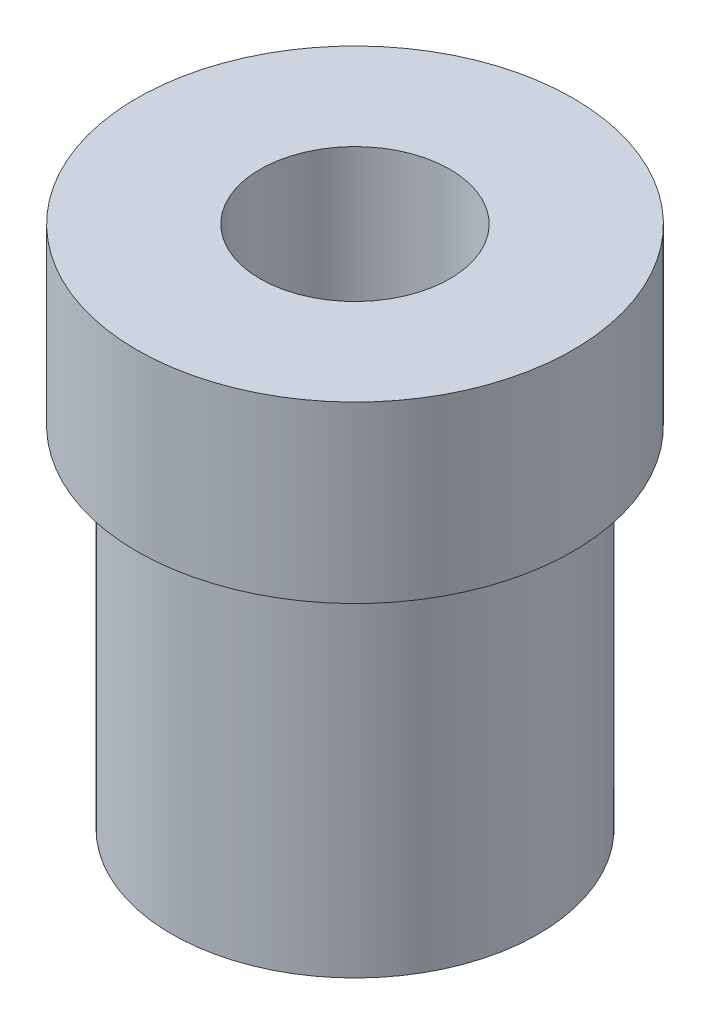
ISO-10303-21;
HEADER;
FILE_DESCRIPTION(('STEP AP214'),'2;1');
FILE_NAME('part.step','',(''),(''),'','','');
FILE_SCHEMA(('AUTOMOTIVE_DESIGN { 1 0 10303 214 1 1 1 1 }'));
ENDSEC;
DATA;
#1=APPLICATION_CONTEXT('core data for automotive mechanical design processes');
#2=APPLICATION_PROTOCOL_DEFINITION('international standard','automotive_design',2000,#1);
#3=PRODUCT_CONTEXT('',#1,'mechanical');
#4=PRODUCT('Part','Part','',(#3));
#5=PRODUCT_RELATED_PRODUCT_CATEGORY('part','',(#4));
#6=PRODUCT_DEFINITION_FORMATION('','',#4);
#7=PRODUCT_DEFINITION_CONTEXT('part definition',#1,'design');
#8=PRODUCT_DEFINITION('design','',#6,#7);
#9=PRODUCT_DEFINITION_SHAPE('','',#8);
#10=(LENGTH_UNIT() NAMED_UNIT(*) SI_UNIT(.MILLI.,.METRE.));
#11=(NAMED_UNIT(*) PLANE_ANGLE_UNIT() SI_UNIT($,.RADIAN.));
#12=(NAMED_UNIT(*) SI_UNIT($,.STERADIAN.) SOLID_ANGLE_UNIT());
#13=UNCERTAINTY_MEASURE_WITH_UNIT(LENGTH_MEASURE(1.E-05),#10,'distance_accuracy_value','');
#14=(GEOMETRIC_REPRESENTATION_CONTEXT(3) GLOBAL_UNCERTAINTY_ASSIGNED_CONTEXT((#13)) GLOBAL_UNIT_ASSIGNED_CONTEXT((#10,
#11,#12)) REPRESENTATION_CONTEXT('',''));
#15=CARTESIAN_POINT('',(0.,0.,0.));
#16=DIRECTION('',(0.,0.,1.));
#17=DIRECTION('',(1.,0.,0.));
#18=AXIS2_PLACEMENT_3D('',#15,#16,#17);
#19=CARTESIAN_POINT('',(0.,6.35,0.));
#20=DIRECTION('',(0.,-1.,0.));
#21=DIRECTION('',(0.,0.,-1.));
#22=AXIS2_PLACEMENT_3D('',#19,#20,#21);
#23=CYLINDRICAL_SURFACE('',#22,7.9375);
#24=CARTESIAN_POINT('',(0.,6.35,0.));
#25=DIRECTION('',(0.,1.,0.));
#26=DIRECTION('',(0.,0.,1.));
#27=AXIS2_PLACEMENT_3D('',#24,#25,#26);
#28=CIRCLE('',#27,7.9375);
#29=CARTESIAN_POINT('',(0.,6.35,7.9375));
#30=VERTEX_POINT('',#29);
#31=EDGE_CURVE('E44',#30,#30,#28,.T.);
#32=ORIENTED_EDGE('',*,*,#31,.F.);
#33=EDGE_LOOP('',(#32));
#34=FACE_BOUND('',#33,.T.);
#35=CARTESIAN_POINT('',(0.,0.,0.));
#36=DIRECTION('',(0.,1.,0.));
#37=DIRECTION('',(0.,0.,1.));
#38=AXIS2_PLACEMENT_3D('',#35,#36,#37);
#39=CIRCLE('',#38,7.9375);
#40=CARTESIAN_POINT('',(0.,0.,7.9375));
#41=VERTEX_POINT('',#40);
#42=EDGE_CURVE('E40',#41,#41,#39,.T.);
#43=ORIENTED_EDGE('',*,*,#42,.T.);
#44=EDGE_LOOP('',(#43));
#45=FACE_BOUND('',#44,.T.);
#46=ADVANCED_FACE('F37',(#34,#45),#23,.T.);
#47=CARTESIAN_POINT('',(0.,6.35,0.));
#48=DIRECTION('',(0.,1.,0.));
#49=DIRECTION('',(0.,0.,1.));
#50=AXIS2_PLACEMENT_3D('',#47,#48,#49);
#51=PLANE('',#50);
#52=CARTESIAN_POINT('',(0.,6.35,0.));
#53=DIRECTION('',(0.,1.,0.));
#54=DIRECTION('',(0.,0.,1.));
#55=AXIS2_PLACEMENT_3D('',#52,#53,#54);
#56=CIRCLE('',#55,3.4544);
#57=CARTESIAN_POINT('',(0.,6.35,3.4544));
#58=VERTEX_POINT('',#57);
#59=EDGE_CURVE('E53',#58,#58,#56,.T.);
#60=ORIENTED_EDGE('',*,*,#59,.F.);
#61=EDGE_LOOP('',(#60));
#62=FACE_BOUND('',#61,.T.);
#63=ORIENTED_EDGE('',*,*,#31,.T.);
#64=EDGE_LOOP('',(#63));
#65=FACE_BOUND('',#64,.T.);
#66=ADVANCED_FACE('F73',(#62,#65),#51,.T.);
#67=CARTESIAN_POINT('',(0.,0.,0.));
#68=DIRECTION('',(0.,1.,0.));
#69=DIRECTION('',(0.,0.,1.));
#70=AXIS2_PLACEMENT_3D('',#67,#68,#69);
#71=PLANE('',#70);
#72=CARTESIAN_POINT('',(0.,0.,0.));
#73=DIRECTION('',(0.,-1.,0.));
#74=DIRECTION('',(0.,0.,-1.));
#75=AXIS2_PLACEMENT_3D('',#72,#73,#74);
#76=CIRCLE('',#75,6.6675);
#77=CARTESIAN_POINT('',(0.,0.,-6.6675));
#78=VERTEX_POINT('',#77);
#79=EDGE_CURVE('E10',#78,#78,#76,.T.);
#80=ORIENTED_EDGE('',*,*,#79,.F.);
#81=EDGE_LOOP('',(#80));
#82=FACE_BOUND('',#81,.T.);
#83=ORIENTED_EDGE('',*,*,#42,.F.);
#84=EDGE_LOOP('',(#83));
#85=FACE_BOUND('',#84,.T.);
#86=ADVANCED_FACE('F79',(#82,#85),#71,.F.);
#87=CARTESIAN_POINT('',(0.,-12.7,0.));
#88=DIRECTION('',(0.,1.,0.));
#89=DIRECTION('',(0.,0.,1.));
#90=AXIS2_PLACEMENT_3D('',#87,#88,#89);
#91=CYLINDRICAL_SURFACE('',#90,6.6675);
#92=CARTESIAN_POINT('',(0.,-12.7,0.));
#93=DIRECTION('',(0.,-1.,0.));
#94=DIRECTION('',(0.,0.,-1.));
#95=AXIS2_PLACEMENT_3D('',#92,#93,#94);
#96=CIRCLE('',#95,6.6675);
#97=CARTESIAN_POINT('',(0.,-12.7,-6.6675));
#98=VERTEX_POINT('',#97);
#99=EDGE_CURVE('E50',#98,#98,#96,.T.);
#100=ORIENTED_EDGE('',*,*,#99,.F.);
#101=EDGE_LOOP('',(#100));
#102=FACE_BOUND('',#101,.T.);
#103=ORIENTED_EDGE('',*,*,#79,.T.);
#104=EDGE_LOOP('',(#103));
#105=FACE_BOUND('',#104,.T.);
#106=ADVANCED_FACE('F70',(#102,#105),#91,.T.);
#107=CARTESIAN_POINT('',(0.,-12.7,0.));
#108=DIRECTION('',(0.,-1.,0.));
#109=DIRECTION('',(0.,0.,-1.));
#110=AXIS2_PLACEMENT_3D('',#107,#108,#109);
#111=PLANE('',#110);
#112=CARTESIAN_POINT('',(0.,-12.7,0.));
#113=DIRECTION('',(0.,1.,0.));
#114=DIRECTION('',(0.,0.,1.));
#115=AXIS2_PLACEMENT_3D('',#112,#113,#114);
#116=CIRCLE('',#115,3.4544);
#117=CARTESIAN_POINT('',(0.,-12.7,3.4544));
#118=VERTEX_POINT('',#117);
#119=EDGE_CURVE('E56',#118,#118,#116,.T.);
#120=ORIENTED_EDGE('',*,*,#119,.T.);
#121=EDGE_LOOP('',(#120));
#122=FACE_BOUND('',#121,.T.);
#123=ORIENTED_EDGE('',*,*,#99,.T.);
#124=EDGE_LOOP('',(#123));
#125=FACE_BOUND('',#124,.T.);
#126=ADVANCED_FACE('F60',(#122,#125),#111,.T.);
#127=CARTESIAN_POINT('',(0.,-12.7,0.));
#128=DIRECTION('',(0.,1.,0.));
#129=DIRECTION('',(0.,0.,1.));
#130=AXIS2_PLACEMENT_3D('',#127,#128,#129);
#131=CYLINDRICAL_SURFACE('',#130,3.4544);
#132=ORIENTED_EDGE('',*,*,#59,.T.);
#133=EDGE_LOOP('',(#132));
#134=FACE_BOUND('',#133,.T.);
#135=ORIENTED_EDGE('',*,*,#119,.F.);
#136=EDGE_LOOP('',(#135));
#137=FACE_BOUND('',#136,.T.);
#138=ADVANCED_FACE('F63',(#134,#137),#131,.F.);
#139=CLOSED_SHELL('',(#46,#66,#86,#106,#126,#138));
#140=MANIFOLD_SOLID_BREP('B2',#139);
#141=ADVANCED_BREP_SHAPE_REPRESENTATION('',(#18,#140),#14);
#142=SHAPE_DEFINITION_REPRESENTATION(#9,#141);
ENDSEC;
END-ISO-10303-21;
